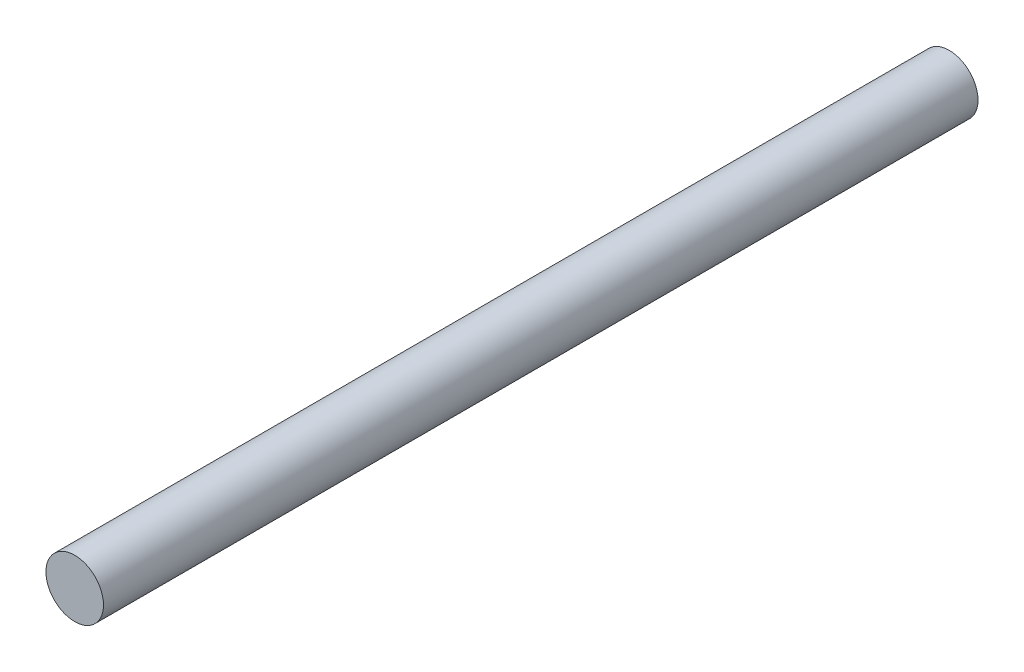
ISO-10303-21;
HEADER;
FILE_DESCRIPTION(('STEP AP214'),'2;1');
FILE_NAME('part.step','',(''),(''),'','','');
FILE_SCHEMA(('AUTOMOTIVE_DESIGN { 1 0 10303 214 1 1 1 1 }'));
ENDSEC;
DATA;
#1=APPLICATION_CONTEXT('core data for automotive mechanical design processes');
#2=APPLICATION_PROTOCOL_DEFINITION('international standard','automotive_design',2000,#1);
#3=PRODUCT_CONTEXT('',#1,'mechanical');
#4=PRODUCT('Part','Part','',(#3));
#5=PRODUCT_RELATED_PRODUCT_CATEGORY('part','',(#4));
#6=PRODUCT_DEFINITION_FORMATION('','',#4);
#7=PRODUCT_DEFINITION_CONTEXT('part definition',#1,'design');
#8=PRODUCT_DEFINITION('design','',#6,#7);
#9=PRODUCT_DEFINITION_SHAPE('','',#8);
#10=(LENGTH_UNIT() NAMED_UNIT(*) SI_UNIT(.MILLI.,.METRE.));
#11=(NAMED_UNIT(*) PLANE_ANGLE_UNIT() SI_UNIT($,.RADIAN.));
#12=(NAMED_UNIT(*) SI_UNIT($,.STERADIAN.) SOLID_ANGLE_UNIT());
#13=UNCERTAINTY_MEASURE_WITH_UNIT(LENGTH_MEASURE(1.E-05),#10,'distance_accuracy_value','');
#14=(GEOMETRIC_REPRESENTATION_CONTEXT(3) GLOBAL_UNCERTAINTY_ASSIGNED_CONTEXT((#13)) GLOBAL_UNIT_ASSIGNED_CONTEXT((#10,
#11,#12)) REPRESENTATION_CONTEXT('',''));
#15=CARTESIAN_POINT('',(0.,0.,0.));
#16=DIRECTION('',(0.,0.,1.));
#17=DIRECTION('',(1.,0.,0.));
#18=AXIS2_PLACEMENT_3D('',#15,#16,#17);
#19=CARTESIAN_POINT('',(0.,0.,76.));
#20=DIRECTION('',(0.,0.,-1.));
#21=DIRECTION('',(-1.,0.,0.));
#22=AXIS2_PLACEMENT_3D('',#19,#20,#21);
#23=CYLINDRICAL_SURFACE('',#22,2.5);
#24=CARTESIAN_POINT('',(0.,0.,76.));
#25=DIRECTION('',(0.,0.,1.));
#26=DIRECTION('',(1.,0.,0.));
#27=AXIS2_PLACEMENT_3D('',#24,#25,#26);
#28=CIRCLE('',#27,2.5);
#29=CARTESIAN_POINT('',(2.5,0.,76.));
#30=VERTEX_POINT('',#29);
#31=EDGE_CURVE('E10',#30,#30,#28,.T.);
#32=ORIENTED_EDGE('',*,*,#31,.F.);
#33=EDGE_LOOP('',(#32));
#34=FACE_BOUND('',#33,.T.);
#35=CARTESIAN_POINT('',(0.,0.,0.));
#36=DIRECTION('',(0.,0.,1.));
#37=DIRECTION('',(1.,0.,0.));
#38=AXIS2_PLACEMENT_3D('',#35,#36,#37);
#39=CIRCLE('',#38,2.5);
#40=CARTESIAN_POINT('',(2.5,0.,0.));
#41=VERTEX_POINT('',#40);
#42=EDGE_CURVE('E37',#41,#41,#39,.T.);
#43=ORIENTED_EDGE('',*,*,#42,.T.);
#44=EDGE_LOOP('',(#43));
#45=FACE_BOUND('',#44,.T.);
#46=ADVANCED_FACE('F34',(#34,#45),#23,.T.);
#47=CARTESIAN_POINT('',(0.,0.,76.));
#48=DIRECTION('',(0.,0.,1.));
#49=DIRECTION('',(1.,0.,0.));
#50=AXIS2_PLACEMENT_3D('',#47,#48,#49);
#51=PLANE('',#50);
#52=ORIENTED_EDGE('',*,*,#31,.T.);
#53=EDGE_LOOP('',(#52));
#54=FACE_BOUND('',#53,.T.);
#55=ADVANCED_FACE('F49',(#54),#51,.T.);
#56=CARTESIAN_POINT('',(0.,0.,0.));
#57=DIRECTION('',(0.,0.,1.));
#58=DIRECTION('',(1.,0.,0.));
#59=AXIS2_PLACEMENT_3D('',#56,#57,#58);
#60=PLANE('',#59);
#61=ORIENTED_EDGE('',*,*,#42,.F.);
#62=EDGE_LOOP('',(#61));
#63=FACE_BOUND('',#62,.T.);
#64=ADVANCED_FACE('F47',(#63),#60,.F.);
#65=CLOSED_SHELL('',(#46,#55,#64));
#66=MANIFOLD_SOLID_BREP('B2',#65);
#67=ADVANCED_BREP_SHAPE_REPRESENTATION('',(#18,#66),#14);
#68=SHAPE_DEFINITION_REPRESENTATION(#9,#67);
ENDSEC;
END-ISO-10303-21;
